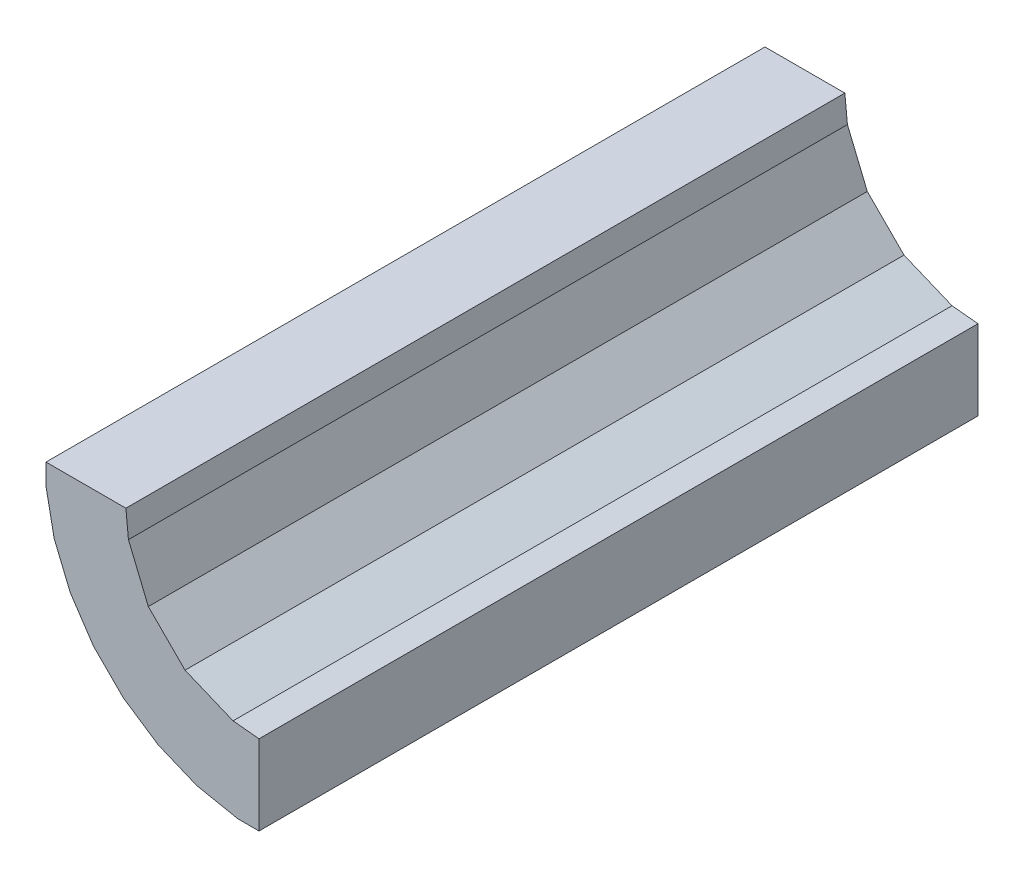
ISO-10303-21;
HEADER;
FILE_DESCRIPTION(('STEP AP214'),'2;1');
FILE_NAME('part.step','',(''),(''),'','','');
FILE_SCHEMA(('AUTOMOTIVE_DESIGN { 1 0 10303 214 1 1 1 1 }'));
ENDSEC;
DATA;
#1=APPLICATION_CONTEXT('core data for automotive mechanical design processes');
#2=APPLICATION_PROTOCOL_DEFINITION('international standard','automotive_design',2000,#1);
#3=PRODUCT_CONTEXT('',#1,'mechanical');
#4=PRODUCT('Part','Part','',(#3));
#5=PRODUCT_RELATED_PRODUCT_CATEGORY('part','',(#4));
#6=PRODUCT_DEFINITION_FORMATION('','',#4);
#7=PRODUCT_DEFINITION_CONTEXT('part definition',#1,'design');
#8=PRODUCT_DEFINITION('design','',#6,#7);
#9=PRODUCT_DEFINITION_SHAPE('','',#8);
#10=(LENGTH_UNIT() NAMED_UNIT(*) SI_UNIT(.MILLI.,.METRE.));
#11=(NAMED_UNIT(*) PLANE_ANGLE_UNIT() SI_UNIT($,.RADIAN.));
#12=(NAMED_UNIT(*) SI_UNIT($,.STERADIAN.) SOLID_ANGLE_UNIT());
#13=UNCERTAINTY_MEASURE_WITH_UNIT(LENGTH_MEASURE(1.E-05),#10,'distance_accuracy_value','');
#14=(GEOMETRIC_REPRESENTATION_CONTEXT(3) GLOBAL_UNCERTAINTY_ASSIGNED_CONTEXT((#13)) GLOBAL_UNIT_ASSIGNED_CONTEXT((#10,
#11,#12)) REPRESENTATION_CONTEXT('',''));
#15=CARTESIAN_POINT('',(0.,0.,0.));
#16=DIRECTION('',(0.,0.,1.));
#17=DIRECTION('',(1.,0.,0.));
#18=AXIS2_PLACEMENT_3D('',#15,#16,#17);
#19=CARTESIAN_POINT('',(1.294999531885,0.344998228945,0.));
#20=DIRECTION('',(0.,-1.,0.));
#21=DIRECTION('',(0.,0.,-1.));
#22=AXIS2_PLACEMENT_3D('',#19,#20,#21);
#23=PLANE('',#22);
#24=DIRECTION('',(0.,0.,1.));
#25=VECTOR('',#24,1.);
#26=CARTESIAN_POINT('',(1.294999531885,0.344998228945,0.));
#27=LINE('',#26,#25);
#28=CARTESIAN_POINT('',(1.294999531885,0.344998228945,0.));
#29=VERTEX_POINT('',#28);
#30=CARTESIAN_POINT('',(1.294999531885,0.344998228945,2.69999968));
#31=VERTEX_POINT('',#30);
#32=EDGE_CURVE('E11',#29,#31,#27,.T.);
#33=ORIENTED_EDGE('',*,*,#32,.T.);
#34=DIRECTION('',(-1.,0.,0.));
#35=VECTOR('',#34,1.);
#36=CARTESIAN_POINT('',(1.294999531885,0.344998228945,2.69999968));
#37=LINE('',#36,#35);
#38=CARTESIAN_POINT('',(1.216206191885,0.344998228945,2.69999968));
#39=VERTEX_POINT('',#38);
#40=EDGE_CURVE('E24',#31,#39,#37,.T.);
#41=ORIENTED_EDGE('',*,*,#40,.T.);
#42=DIRECTION('',(0.,0.,1.));
#43=VECTOR('',#42,1.);
#44=CARTESIAN_POINT('',(1.216206191885,0.344998228945,0.));
#45=LINE('',#44,#43);
#46=CARTESIAN_POINT('',(1.216206191885,0.344998228945,0.));
#47=VERTEX_POINT('',#46);
#48=EDGE_CURVE('E253',#47,#39,#45,.T.);
#49=ORIENTED_EDGE('',*,*,#48,.F.);
#50=DIRECTION('',(-1.,0.,0.));
#51=VECTOR('',#50,1.);
#52=CARTESIAN_POINT('',(1.294999531885,0.344998228945,0.));
#53=LINE('',#52,#51);
#54=EDGE_CURVE('E251',#29,#47,#53,.T.);
#55=ORIENTED_EDGE('',*,*,#54,.F.);
#56=EDGE_LOOP('',(#33,#41,#49,#55));
#57=FACE_BOUND('',#56,.T.);
#58=ADVANCED_FACE('F17',(#57),#23,.T.);
#59=CARTESIAN_POINT('',(1.216206191885,0.344998228945,0.));
#60=DIRECTION('',(-0.195077646083951,-0.980787801717754,0.));
#61=DIRECTION('',(-0.980787801717754,0.195077646083951,0.));
#62=AXIS2_PLACEMENT_3D('',#59,#60,#61);
#63=PLANE('',#62);
#64=ORIENTED_EDGE('',*,*,#48,.T.);
#65=DIRECTION('',(-0.980787801717754,0.195077646083951,0.));
#66=VECTOR('',#65,1.);
#67=CARTESIAN_POINT('',(1.216206191885,0.344998228945,2.69999968));
#68=LINE('',#67,#66);
#69=CARTESIAN_POINT('',(1.061647191885,0.375739848945,2.69999968));
#70=VERTEX_POINT('',#69);
#71=EDGE_CURVE('E249',#39,#70,#68,.T.);
#72=ORIENTED_EDGE('',*,*,#71,.T.);
#73=DIRECTION('',(0.,0.,1.));
#74=VECTOR('',#73,1.);
#75=CARTESIAN_POINT('',(1.061647191885,0.375739848945,0.));
#76=LINE('',#75,#74);
#77=CARTESIAN_POINT('',(1.061647191885,0.375739848945,0.));
#78=VERTEX_POINT('',#77);
#79=EDGE_CURVE('E246',#78,#70,#76,.T.);
#80=ORIENTED_EDGE('',*,*,#79,.F.);
#81=DIRECTION('',(-0.980787801717754,0.195077646083951,0.));
#82=VECTOR('',#81,1.);
#83=CARTESIAN_POINT('',(1.216206191885,0.344998228945,0.));
#84=LINE('',#83,#82);
#85=EDGE_CURVE('E243',#47,#78,#84,.T.);
#86=ORIENTED_EDGE('',*,*,#85,.F.);
#87=EDGE_LOOP('',(#64,#72,#80,#86));
#88=FACE_BOUND('',#87,.T.);
#89=ADVANCED_FACE('F259',(#88),#63,.T.);
#90=CARTESIAN_POINT('',(1.061647191885,0.375739848945,0.));
#91=DIRECTION('',(-0.382692963925958,-0.9238755843519,0.));
#92=DIRECTION('',(-0.9238755843519,0.382692963925958,0.));
#93=AXIS2_PLACEMENT_3D('',#90,#91,#92);
#94=PLANE('',#93);
#95=ORIENTED_EDGE('',*,*,#79,.T.);
#96=DIRECTION('',(-0.9238755843519,0.382692963925958,0.));
#97=VECTOR('',#96,1.);
#98=CARTESIAN_POINT('',(1.061647191885,0.375739848945,2.69999968));
#99=LINE('',#98,#97);
#100=CARTESIAN_POINT('',(0.91605693188501,0.436047068945,2.69999968));
#101=VERTEX_POINT('',#100);
#102=EDGE_CURVE('E241',#70,#101,#99,.T.);
#103=ORIENTED_EDGE('',*,*,#102,.T.);
#104=DIRECTION('',(0.,0.,1.));
#105=VECTOR('',#104,1.);
#106=CARTESIAN_POINT('',(0.91605693188501,0.436047068945,0.));
#107=LINE('',#106,#105);
#108=CARTESIAN_POINT('',(0.91605693188501,0.436047068945,0.));
#109=VERTEX_POINT('',#108);
#110=EDGE_CURVE('E238',#109,#101,#107,.T.);
#111=ORIENTED_EDGE('',*,*,#110,.F.);
#112=DIRECTION('',(-0.9238755843519,0.382692963925958,0.));
#113=VECTOR('',#112,1.);
#114=CARTESIAN_POINT('',(1.061647191885,0.375739848945,0.));
#115=LINE('',#114,#113);
#116=EDGE_CURVE('E235',#78,#109,#115,.T.);
#117=ORIENTED_EDGE('',*,*,#116,.F.);
#118=EDGE_LOOP('',(#95,#103,#111,#117));
#119=FACE_BOUND('',#118,.T.);
#120=ADVANCED_FACE('F265',(#119),#94,.T.);
#121=CARTESIAN_POINT('',(0.91605693188501,0.436047068945,0.));
#122=DIRECTION('',(-0.555562842653059,-0.831474550340089,0.));
#123=DIRECTION('',(-0.831474550340089,0.555562842653059,0.));
#124=AXIS2_PLACEMENT_3D('',#121,#122,#123);
#125=PLANE('',#124);
#126=ORIENTED_EDGE('',*,*,#110,.T.);
#127=DIRECTION('',(-0.831474550340089,0.555562842653059,0.));
#128=VECTOR('',#127,1.);
#129=CARTESIAN_POINT('',(0.91605693188501,0.436047068945,2.69999968));
#130=LINE('',#129,#128);
#131=CARTESIAN_POINT('',(0.785028491885,0.523595788945,2.69999968));
#132=VERTEX_POINT('',#131);
#133=EDGE_CURVE('E233',#101,#132,#130,.T.);
#134=ORIENTED_EDGE('',*,*,#133,.T.);
#135=DIRECTION('',(0.,0.,1.));
#136=VECTOR('',#135,1.);
#137=CARTESIAN_POINT('',(0.785028491885,0.523595788945,0.));
#138=LINE('',#137,#136);
#139=CARTESIAN_POINT('',(0.785028491885,0.523595788945,0.));
#140=VERTEX_POINT('',#139);
#141=EDGE_CURVE('E230',#140,#132,#138,.T.);
#142=ORIENTED_EDGE('',*,*,#141,.F.);
#143=DIRECTION('',(-0.831474550340089,0.555562842653059,0.));
#144=VECTOR('',#143,1.);
#145=CARTESIAN_POINT('',(0.91605693188501,0.436047068945,0.));
#146=LINE('',#145,#144);
#147=EDGE_CURVE('E227',#109,#140,#146,.T.);
#148=ORIENTED_EDGE('',*,*,#147,.F.);
#149=EDGE_LOOP('',(#126,#134,#142,#148));
#150=FACE_BOUND('',#149,.T.);
#151=ADVANCED_FACE('F269',(#150),#125,.T.);
#152=CARTESIAN_POINT('',(0.785028491885,0.523595788945,0.));
#153=DIRECTION('',(-0.707106781186548,-0.707106781186548,0.));
#154=DIRECTION('',(-0.707106781186548,0.707106781186548,0.));
#155=AXIS2_PLACEMENT_3D('',#152,#153,#154);
#156=PLANE('',#155);
#157=ORIENTED_EDGE('',*,*,#141,.T.);
#158=DIRECTION('',(-0.707106781186548,0.707106781186548,0.));
#159=VECTOR('',#158,1.);
#160=CARTESIAN_POINT('',(0.785028491885,0.523595788945,2.69999968));
#161=LINE('',#160,#159);
#162=CARTESIAN_POINT('',(0.673596151885,0.635028128945,2.69999968));
#163=VERTEX_POINT('',#162);
#164=EDGE_CURVE('E225',#132,#163,#161,.T.);
#165=ORIENTED_EDGE('',*,*,#164,.T.);
#166=DIRECTION('',(0.,0.,1.));
#167=VECTOR('',#166,1.);
#168=CARTESIAN_POINT('',(0.673596151885,0.635028128945,0.));
#169=LINE('',#168,#167);
#170=CARTESIAN_POINT('',(0.673596151885,0.635028128945,0.));
#171=VERTEX_POINT('',#170);
#172=EDGE_CURVE('E222',#171,#163,#169,.T.);
#173=ORIENTED_EDGE('',*,*,#172,.F.);
#174=DIRECTION('',(-0.707106781186548,0.707106781186548,0.));
#175=VECTOR('',#174,1.);
#176=CARTESIAN_POINT('',(0.785028491885,0.523595788945,0.));
#177=LINE('',#176,#175);
#178=EDGE_CURVE('E219',#140,#171,#177,.T.);
#179=ORIENTED_EDGE('',*,*,#178,.F.);
#180=EDGE_LOOP('',(#157,#165,#173,#179));
#181=FACE_BOUND('',#180,.T.);
#182=ADVANCED_FACE('F273',(#181),#156,.T.);
#183=CARTESIAN_POINT('',(0.673596151885,0.635028128945,0.));
#184=DIRECTION('',(-0.831474550340089,-0.555562842653059,0.));
#185=DIRECTION('',(-0.555562842653059,0.831474550340089,0.));
#186=AXIS2_PLACEMENT_3D('',#183,#184,#185);
#187=PLANE('',#186);
#188=ORIENTED_EDGE('',*,*,#172,.T.);
#189=DIRECTION('',(-0.555562842653059,0.831474550340089,0.));
#190=VECTOR('',#189,1.);
#191=CARTESIAN_POINT('',(0.673596151885,0.635028128945,2.69999968));
#192=LINE('',#191,#190);
#193=CARTESIAN_POINT('',(0.586047431885,0.766056568945,2.69999968));
#194=VERTEX_POINT('',#193);
#195=EDGE_CURVE('E217',#163,#194,#192,.T.);
#196=ORIENTED_EDGE('',*,*,#195,.T.);
#197=DIRECTION('',(0.,0.,1.));
#198=VECTOR('',#197,1.);
#199=CARTESIAN_POINT('',(0.586047431885,0.766056568945,0.));
#200=LINE('',#199,#198);
#201=CARTESIAN_POINT('',(0.586047431885,0.766056568945,0.));
#202=VERTEX_POINT('',#201);
#203=EDGE_CURVE('E214',#202,#194,#200,.T.);
#204=ORIENTED_EDGE('',*,*,#203,.F.);
#205=DIRECTION('',(-0.555562842653059,0.831474550340089,0.));
#206=VECTOR('',#205,1.);
#207=CARTESIAN_POINT('',(0.673596151885,0.635028128945,0.));
#208=LINE('',#207,#206);
#209=EDGE_CURVE('E211',#171,#202,#208,.T.);
#210=ORIENTED_EDGE('',*,*,#209,.F.);
#211=EDGE_LOOP('',(#188,#196,#204,#210));
#212=FACE_BOUND('',#211,.T.);
#213=ADVANCED_FACE('F276',(#212),#187,.T.);
#214=CARTESIAN_POINT('',(0.586047431885,0.766056568945,0.));
#215=DIRECTION('',(-0.9238755843519,-0.382692963925958,0.));
#216=DIRECTION('',(-0.382692963925958,0.9238755843519,0.));
#217=AXIS2_PLACEMENT_3D('',#214,#215,#216);
#218=PLANE('',#217);
#219=ORIENTED_EDGE('',*,*,#203,.T.);
#220=DIRECTION('',(-0.382692963925958,0.9238755843519,0.));
#221=VECTOR('',#220,1.);
#222=CARTESIAN_POINT('',(0.586047431885,0.766056568945,2.69999968));
#223=LINE('',#222,#221);
#224=CARTESIAN_POINT('',(0.525740211885,0.911646828945,2.69999968));
#225=VERTEX_POINT('',#224);
#226=EDGE_CURVE('E209',#194,#225,#223,.T.);
#227=ORIENTED_EDGE('',*,*,#226,.T.);
#228=DIRECTION('',(0.,0.,1.));
#229=VECTOR('',#228,1.);
#230=CARTESIAN_POINT('',(0.525740211885,0.911646828945,0.));
#231=LINE('',#230,#229);
#232=CARTESIAN_POINT('',(0.525740211885,0.911646828945,0.));
#233=VERTEX_POINT('',#232);
#234=EDGE_CURVE('E206',#233,#225,#231,.T.);
#235=ORIENTED_EDGE('',*,*,#234,.F.);
#236=DIRECTION('',(-0.382692963925958,0.9238755843519,0.));
#237=VECTOR('',#236,1.);
#238=CARTESIAN_POINT('',(0.586047431885,0.766056568945,0.));
#239=LINE('',#238,#237);
#240=EDGE_CURVE('E203',#202,#233,#239,.T.);
#241=ORIENTED_EDGE('',*,*,#240,.F.);
#242=EDGE_LOOP('',(#219,#227,#235,#241));
#243=FACE_BOUND('',#242,.T.);
#244=ADVANCED_FACE('F281',(#243),#218,.T.);
#245=CARTESIAN_POINT('',(0.525740211885,0.911646828945,0.));
#246=DIRECTION('',(-0.980787801717754,-0.195077646083951,0.));
#247=DIRECTION('',(-0.195077646083951,0.980787801717754,0.));
#248=AXIS2_PLACEMENT_3D('',#245,#246,#247);
#249=PLANE('',#248);
#250=ORIENTED_EDGE('',*,*,#234,.T.);
#251=DIRECTION('',(-0.195077646083951,0.980787801717754,0.));
#252=VECTOR('',#251,1.);
#253=CARTESIAN_POINT('',(0.525740211885,0.911646828945,2.69999968));
#254=LINE('',#253,#252);
#255=CARTESIAN_POINT('',(0.494998591885,1.066205828945,2.69999968));
#256=VERTEX_POINT('',#255);
#257=EDGE_CURVE('E201',#225,#256,#254,.T.);
#258=ORIENTED_EDGE('',*,*,#257,.T.);
#259=DIRECTION('',(0.,0.,1.));
#260=VECTOR('',#259,1.);
#261=CARTESIAN_POINT('',(0.494998591885,1.066205828945,0.));
#262=LINE('',#261,#260);
#263=CARTESIAN_POINT('',(0.494998591885,1.066205828945,0.));
#264=VERTEX_POINT('',#263);
#265=EDGE_CURVE('E198',#264,#256,#262,.T.);
#266=ORIENTED_EDGE('',*,*,#265,.F.);
#267=DIRECTION('',(-0.195077646083951,0.980787801717754,0.));
#268=VECTOR('',#267,1.);
#269=CARTESIAN_POINT('',(0.525740211885,0.911646828945,0.));
#270=LINE('',#269,#268);
#271=EDGE_CURVE('E195',#233,#264,#270,.T.);
#272=ORIENTED_EDGE('',*,*,#271,.F.);
#273=EDGE_LOOP('',(#250,#258,#266,#272));
#274=FACE_BOUND('',#273,.T.);
#275=ADVANCED_FACE('F285',(#274),#249,.T.);
#276=CARTESIAN_POINT('',(0.494998591885,1.066205828945,0.));
#277=DIRECTION('',(-1.,0.,0.));
#278=DIRECTION('',(0.,0.,1.));
#279=AXIS2_PLACEMENT_3D('',#276,#277,#278);
#280=PLANE('',#279);
#281=ORIENTED_EDGE('',*,*,#265,.T.);
#282=DIRECTION('',(0.,1.,0.));
#283=VECTOR('',#282,1.);
#284=CARTESIAN_POINT('',(0.494998591885,1.066205828945,2.69999968));
#285=LINE('',#284,#283);
#286=CARTESIAN_POINT('',(0.494998591885,1.144999168945,2.69999968));
#287=VERTEX_POINT('',#286);
#288=EDGE_CURVE('E193',#256,#287,#285,.T.);
#289=ORIENTED_EDGE('',*,*,#288,.T.);
#290=DIRECTION('',(0.,0.,1.));
#291=VECTOR('',#290,1.);
#292=CARTESIAN_POINT('',(0.494998591885,1.144999168945,0.));
#293=LINE('',#292,#291);
#294=CARTESIAN_POINT('',(0.494998591885,1.144999168945,0.));
#295=VERTEX_POINT('',#294);
#296=EDGE_CURVE('E190',#295,#287,#293,.T.);
#297=ORIENTED_EDGE('',*,*,#296,.F.);
#298=DIRECTION('',(0.,1.,0.));
#299=VECTOR('',#298,1.);
#300=CARTESIAN_POINT('',(0.494998591885,1.066205828945,0.));
#301=LINE('',#300,#299);
#302=EDGE_CURVE('E187',#264,#295,#301,.T.);
#303=ORIENTED_EDGE('',*,*,#302,.F.);
#304=EDGE_LOOP('',(#281,#289,#297,#303));
#305=FACE_BOUND('',#304,.T.);
#306=ADVANCED_FACE('F289',(#305),#280,.T.);
#307=CARTESIAN_POINT('',(0.494998591885,1.144999168945,0.));
#308=DIRECTION('',(0.,1.,0.));
#309=DIRECTION('',(1.,0.,0.));
#310=AXIS2_PLACEMENT_3D('',#307,#308,#309);
#311=PLANE('',#310);
#312=ORIENTED_EDGE('',*,*,#296,.T.);
#313=DIRECTION('',(1.,0.,0.));
#314=VECTOR('',#313,1.);
#315=CARTESIAN_POINT('',(0.494998591885,1.144999168945,2.69999968));
#316=LINE('',#315,#314);
#317=CARTESIAN_POINT('',(0.794997991885,1.144999168945,2.69999968));
#318=VERTEX_POINT('',#317);
#319=EDGE_CURVE('E185',#287,#318,#316,.T.);
#320=ORIENTED_EDGE('',*,*,#319,.T.);
#321=DIRECTION('',(0.,0.,1.));
#322=VECTOR('',#321,1.);
#323=CARTESIAN_POINT('',(0.794997991885,1.144999168945,0.));
#324=LINE('',#323,#322);
#325=CARTESIAN_POINT('',(0.794997991885,1.144999168945,0.));
#326=VERTEX_POINT('',#325);
#327=EDGE_CURVE('E182',#326,#318,#324,.T.);
#328=ORIENTED_EDGE('',*,*,#327,.F.);
#329=DIRECTION('',(1.,0.,0.));
#330=VECTOR('',#329,1.);
#331=CARTESIAN_POINT('',(0.494998591885,1.144999168945,0.));
#332=LINE('',#331,#330);
#333=EDGE_CURVE('E179',#295,#326,#332,.T.);
#334=ORIENTED_EDGE('',*,*,#333,.F.);
#335=EDGE_LOOP('',(#312,#320,#328,#334));
#336=FACE_BOUND('',#335,.T.);
#337=ADVANCED_FACE('F292',(#336),#311,.T.);
#338=CARTESIAN_POINT('',(0.794997991885,1.144999168945,0.));
#339=DIRECTION('',(0.995185899107576,0.0980052356634382,0.));
#340=DIRECTION('',(0.,0.,-1.));
#341=AXIS2_PLACEMENT_3D('',#338,#339,#340);
#342=PLANE('',#341);
#343=ORIENTED_EDGE('',*,*,#327,.T.);
#344=DIRECTION('',(0.0980052356634382,-0.995185899107576,0.));
#345=VECTOR('',#344,1.);
#346=CARTESIAN_POINT('',(0.794997991885,1.144999168945,2.69999968));
#347=LINE('',#346,#345);
#348=CARTESIAN_POINT('',(0.80460427188501,1.047453008945,2.69999968));
#349=VERTEX_POINT('',#348);
#350=EDGE_CURVE('E177',#318,#349,#347,.T.);
#351=ORIENTED_EDGE('',*,*,#350,.T.);
#352=DIRECTION('',(0.,0.,1.));
#353=VECTOR('',#352,1.);
#354=CARTESIAN_POINT('',(0.80460427188501,1.047453008945,0.));
#355=LINE('',#354,#353);
#356=CARTESIAN_POINT('',(0.80460427188501,1.047453008945,0.));
#357=VERTEX_POINT('',#356);
#358=EDGE_CURVE('E174',#357,#349,#355,.T.);
#359=ORIENTED_EDGE('',*,*,#358,.F.);
#360=DIRECTION('',(0.0980052356634382,-0.995185899107576,0.));
#361=VECTOR('',#360,1.);
#362=CARTESIAN_POINT('',(0.794997991885,1.144999168945,0.));
#363=LINE('',#362,#361);
#364=EDGE_CURVE('E171',#326,#357,#363,.T.);
#365=ORIENTED_EDGE('',*,*,#364,.F.);
#366=EDGE_LOOP('',(#343,#351,#359,#365));
#367=FACE_BOUND('',#366,.T.);
#368=ADVANCED_FACE('F297',(#367),#342,.T.);
#369=CARTESIAN_POINT('',(0.80460427188501,1.047453008945,0.));
#370=DIRECTION('',(0.923879572096044,0.382683336799019,0.));
#371=DIRECTION('',(0.,0.,-1.));
#372=AXIS2_PLACEMENT_3D('',#369,#370,#371);
#373=PLANE('',#372);
#374=ORIENTED_EDGE('',*,*,#358,.T.);
#375=DIRECTION('',(0.382683336799019,-0.923879572096044,0.));
#376=VECTOR('',#375,1.);
#377=CARTESIAN_POINT('',(0.80460427188501,1.047453008945,2.69999968));
#378=LINE('',#377,#376);
#379=CARTESIAN_POINT('',(0.87926249188501,0.867212068945,2.69999968));
#380=VERTEX_POINT('',#379);
#381=EDGE_CURVE('E169',#349,#380,#378,.T.);
#382=ORIENTED_EDGE('',*,*,#381,.T.);
#383=DIRECTION('',(0.,0.,1.));
#384=VECTOR('',#383,1.);
#385=CARTESIAN_POINT('',(0.87926249188501,0.867212068945,0.));
#386=LINE('',#385,#384);
#387=CARTESIAN_POINT('',(0.87926249188501,0.867212068945,0.));
#388=VERTEX_POINT('',#387);
#389=EDGE_CURVE('E166',#388,#380,#386,.T.);
#390=ORIENTED_EDGE('',*,*,#389,.F.);
#391=DIRECTION('',(0.382683336799019,-0.923879572096044,0.));
#392=VECTOR('',#391,1.);
#393=CARTESIAN_POINT('',(0.80460427188501,1.047453008945,0.));
#394=LINE('',#393,#392);
#395=EDGE_CURVE('E163',#357,#388,#394,.T.);
#396=ORIENTED_EDGE('',*,*,#395,.F.);
#397=EDGE_LOOP('',(#374,#382,#390,#396));
#398=FACE_BOUND('',#397,.T.);
#399=ADVANCED_FACE('F301',(#398),#373,.T.);
#400=CARTESIAN_POINT('',(0.87926249188501,0.867212068945,0.));
#401=DIRECTION('',(0.707106781186548,0.707106781186548,0.));
#402=DIRECTION('',(0.,0.,-1.));
#403=AXIS2_PLACEMENT_3D('',#400,#401,#402);
#404=PLANE('',#403);
#405=ORIENTED_EDGE('',*,*,#389,.T.);
#406=DIRECTION('',(0.707106781186548,-0.707106781186548,0.));
#407=VECTOR('',#406,1.);
#408=CARTESIAN_POINT('',(0.87926249188501,0.867212068945,2.69999968));
#409=LINE('',#408,#407);
#410=CARTESIAN_POINT('',(1.017212431885,0.729262128945,2.69999968));
#411=VERTEX_POINT('',#410);
#412=EDGE_CURVE('E161',#380,#411,#409,.T.);
#413=ORIENTED_EDGE('',*,*,#412,.T.);
#414=DIRECTION('',(0.,0.,1.));
#415=VECTOR('',#414,1.);
#416=CARTESIAN_POINT('',(1.017212431885,0.729262128945,0.));
#417=LINE('',#416,#415);
#418=CARTESIAN_POINT('',(1.017212431885,0.729262128945,0.));
#419=VERTEX_POINT('',#418);
#420=EDGE_CURVE('E158',#419,#411,#417,.T.);
#421=ORIENTED_EDGE('',*,*,#420,.F.);
#422=DIRECTION('',(0.707106781186548,-0.707106781186548,0.));
#423=VECTOR('',#422,1.);
#424=CARTESIAN_POINT('',(0.87926249188501,0.867212068945,0.));
#425=LINE('',#424,#423);
#426=EDGE_CURVE('E156',#388,#419,#425,.T.);
#427=ORIENTED_EDGE('',*,*,#426,.F.);
#428=EDGE_LOOP('',(#405,#413,#421,#427));
#429=FACE_BOUND('',#428,.T.);
#430=ADVANCED_FACE('F304',(#429),#404,.T.);
#431=CARTESIAN_POINT('',(1.017212431885,0.729262128945,0.));
#432=DIRECTION('',(0.382683336799019,0.923879572096044,0.));
#433=DIRECTION('',(0.,0.,-1.));
#434=AXIS2_PLACEMENT_3D('',#431,#432,#433);
#435=PLANE('',#434);
#436=ORIENTED_EDGE('',*,*,#420,.T.);
#437=DIRECTION('',(0.923879572096044,-0.382683336799019,0.));
#438=VECTOR('',#437,1.);
#439=CARTESIAN_POINT('',(1.017212431885,0.729262128945,2.69999968));
#440=LINE('',#439,#438);
#441=CARTESIAN_POINT('',(1.197453371885,0.654603908945,2.69999968));
#442=VERTEX_POINT('',#441);
#443=EDGE_CURVE('E154',#411,#442,#440,.T.);
#444=ORIENTED_EDGE('',*,*,#443,.T.);
#445=DIRECTION('',(0.,0.,1.));
#446=VECTOR('',#445,1.);
#447=CARTESIAN_POINT('',(1.197453371885,0.654603908945,0.));
#448=LINE('',#447,#446);
#449=CARTESIAN_POINT('',(1.197453371885,0.654603908945,0.));
#450=VERTEX_POINT('',#449);
#451=EDGE_CURVE('E152',#450,#442,#448,.T.);
#452=ORIENTED_EDGE('',*,*,#451,.F.);
#453=DIRECTION('',(0.923879572096044,-0.382683336799019,0.));
#454=VECTOR('',#453,1.);
#455=CARTESIAN_POINT('',(1.017212431885,0.729262128945,0.));
#456=LINE('',#455,#454);
#457=EDGE_CURVE('E143',#419,#450,#456,.T.);
#458=ORIENTED_EDGE('',*,*,#457,.F.);
#459=EDGE_LOOP('',(#436,#444,#452,#458));
#460=FACE_BOUND('',#459,.T.);
#461=ADVANCED_FACE('F307',(#460),#435,.T.);
#462=CARTESIAN_POINT('',(1.197453371885,0.654603908945,0.));
#463=DIRECTION('',(0.0980052356633193,0.995185899107587,0.));
#464=DIRECTION('',(0.,0.,-1.));
#465=AXIS2_PLACEMENT_3D('',#462,#463,#464);
#466=PLANE('',#465);
#467=ORIENTED_EDGE('',*,*,#451,.T.);
#468=DIRECTION('',(0.995185899107587,-0.0980052356633194,0.));
#469=VECTOR('',#468,1.);
#470=CARTESIAN_POINT('',(1.197453371885,0.654603908945,2.69999968));
#471=LINE('',#470,#469);
#472=CARTESIAN_POINT('',(1.294999531885,0.644997628945,2.69999968));
#473=VERTEX_POINT('',#472);
#474=EDGE_CURVE('E132',#442,#473,#471,.T.);
#475=ORIENTED_EDGE('',*,*,#474,.T.);
#476=DIRECTION('',(0.,0.,1.));
#477=VECTOR('',#476,1.);
#478=CARTESIAN_POINT('',(1.294999531885,0.644997628945,0.));
#479=LINE('',#478,#477);
#480=CARTESIAN_POINT('',(1.294999531885,0.644997628945,0.));
#481=VERTEX_POINT('',#480);
#482=EDGE_CURVE('E126',#481,#473,#479,.T.);
#483=ORIENTED_EDGE('',*,*,#482,.F.);
#484=DIRECTION('',(0.995185899107587,-0.0980052356633194,0.));
#485=VECTOR('',#484,1.);
#486=CARTESIAN_POINT('',(1.197453371885,0.654603908945,0.));
#487=LINE('',#486,#485);
#488=EDGE_CURVE('E130',#450,#481,#487,.T.);
#489=ORIENTED_EDGE('',*,*,#488,.F.);
#490=EDGE_LOOP('',(#467,#475,#483,#489));
#491=FACE_BOUND('',#490,.T.);
#492=ADVANCED_FACE('F129',(#491),#466,.T.);
#493=CARTESIAN_POINT('',(1.294999531885,0.644997628945,0.));
#494=DIRECTION('',(1.,0.,0.));
#495=DIRECTION('',(0.,1.,0.));
#496=AXIS2_PLACEMENT_3D('',#493,#494,#495);
#497=PLANE('',#496);
#498=ORIENTED_EDGE('',*,*,#482,.T.);
#499=DIRECTION('',(0.,-1.,0.));
#500=VECTOR('',#499,1.);
#501=CARTESIAN_POINT('',(1.294999531885,0.644997628945,2.69999968));
#502=LINE('',#501,#500);
#503=EDGE_CURVE('E144',#473,#31,#502,.T.);
#504=ORIENTED_EDGE('',*,*,#503,.T.);
#505=ORIENTED_EDGE('',*,*,#32,.F.);
#506=DIRECTION('',(0.,-1.,0.));
#507=VECTOR('',#506,1.);
#508=CARTESIAN_POINT('',(1.294999531885,0.644997628945,0.));
#509=LINE('',#508,#507);
#510=EDGE_CURVE('E140',#481,#29,#509,.T.);
#511=ORIENTED_EDGE('',*,*,#510,.F.);
#512=EDGE_LOOP('',(#498,#504,#505,#511));
#513=FACE_BOUND('',#512,.T.);
#514=ADVANCED_FACE('F146',(#513),#497,.T.);
#515=CARTESIAN_POINT('',(1.294999531885,0.344998228945,0.));
#516=DIRECTION('',(0.,0.,1.));
#517=DIRECTION('',(1.,0.,0.));
#518=AXIS2_PLACEMENT_3D('',#515,#516,#517);
#519=PLANE('',#518);
#520=ORIENTED_EDGE('',*,*,#54,.T.);
#521=ORIENTED_EDGE('',*,*,#85,.T.);
#522=ORIENTED_EDGE('',*,*,#116,.T.);
#523=ORIENTED_EDGE('',*,*,#147,.T.);
#524=ORIENTED_EDGE('',*,*,#178,.T.);
#525=ORIENTED_EDGE('',*,*,#209,.T.);
#526=ORIENTED_EDGE('',*,*,#240,.T.);
#527=ORIENTED_EDGE('',*,*,#271,.T.);
#528=ORIENTED_EDGE('',*,*,#302,.T.);
#529=ORIENTED_EDGE('',*,*,#333,.T.);
#530=ORIENTED_EDGE('',*,*,#364,.T.);
#531=ORIENTED_EDGE('',*,*,#395,.T.);
#532=ORIENTED_EDGE('',*,*,#426,.T.);
#533=ORIENTED_EDGE('',*,*,#457,.T.);
#534=ORIENTED_EDGE('',*,*,#488,.T.);
#535=ORIENTED_EDGE('',*,*,#510,.T.);
#536=EDGE_LOOP('',(#520,#521,#522,#523,#524,#525,#526,#527,#528,#529,#530,#531,#532,#533,#534,#535));
#537=FACE_BOUND('',#536,.T.);
#538=ADVANCED_FACE('F139',(#537),#519,.F.);
#539=CARTESIAN_POINT('',(1.294999531885,0.344998228945,2.69999968));
#540=DIRECTION('',(0.,0.,1.));
#541=DIRECTION('',(1.,0.,0.));
#542=AXIS2_PLACEMENT_3D('',#539,#540,#541);
#543=PLANE('',#542);
#544=ORIENTED_EDGE('',*,*,#503,.F.);
#545=ORIENTED_EDGE('',*,*,#474,.F.);
#546=ORIENTED_EDGE('',*,*,#443,.F.);
#547=ORIENTED_EDGE('',*,*,#412,.F.);
#548=ORIENTED_EDGE('',*,*,#381,.F.);
#549=ORIENTED_EDGE('',*,*,#350,.F.);
#550=ORIENTED_EDGE('',*,*,#319,.F.);
#551=ORIENTED_EDGE('',*,*,#288,.F.);
#552=ORIENTED_EDGE('',*,*,#257,.F.);
#553=ORIENTED_EDGE('',*,*,#226,.F.);
#554=ORIENTED_EDGE('',*,*,#195,.F.);
#555=ORIENTED_EDGE('',*,*,#164,.F.);
#556=ORIENTED_EDGE('',*,*,#133,.F.);
#557=ORIENTED_EDGE('',*,*,#102,.F.);
#558=ORIENTED_EDGE('',*,*,#71,.F.);
#559=ORIENTED_EDGE('',*,*,#40,.F.);
#560=EDGE_LOOP('',(#544,#545,#546,#547,#548,#549,#550,#551,#552,#553,#554,#555,#556,#557,#558,#559));
#561=FACE_BOUND('',#560,.T.);
#562=ADVANCED_FACE('F261',(#561),#543,.T.);
#563=CLOSED_SHELL('',(#58,#89,#120,#151,#182,#213,#244,#275,#306,#337,#368,#399,#430,#461,#492,
#514,#538,#562));
#564=MANIFOLD_SOLID_BREP('B1',#563);
#565=ADVANCED_BREP_SHAPE_REPRESENTATION('',(#18,#564),#14);
#566=SHAPE_DEFINITION_REPRESENTATION(#9,#565);
ENDSEC;
END-ISO-10303-21;
